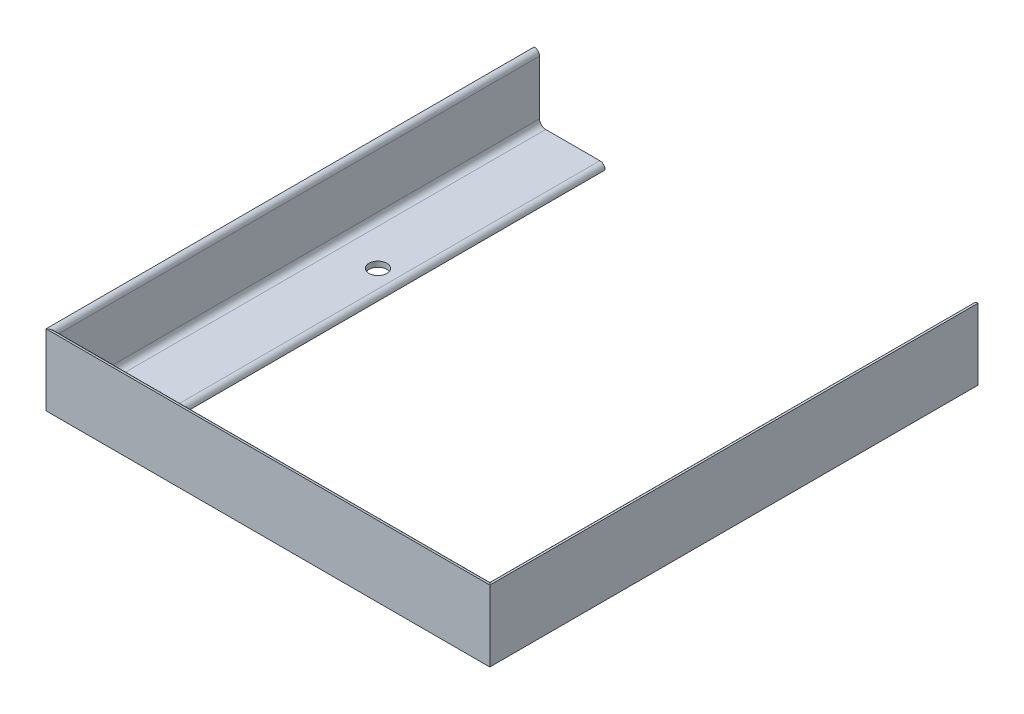
ISO-10303-21;
HEADER;
FILE_DESCRIPTION(('STEP AP214'),'2;1');
FILE_NAME('part.step','',(''),(''),'','','');
FILE_SCHEMA(('AUTOMOTIVE_DESIGN { 1 0 10303 214 1 1 1 1 }'));
ENDSEC;
DATA;
#1=APPLICATION_CONTEXT('core data for automotive mechanical design processes');
#2=APPLICATION_PROTOCOL_DEFINITION('international standard','automotive_design',2000,#1);
#3=PRODUCT_CONTEXT('',#1,'mechanical');
#4=PRODUCT('Part','Part','',(#3));
#5=PRODUCT_RELATED_PRODUCT_CATEGORY('part','',(#4));
#6=PRODUCT_DEFINITION_FORMATION('','',#4);
#7=PRODUCT_DEFINITION_CONTEXT('part definition',#1,'design');
#8=PRODUCT_DEFINITION('design','',#6,#7);
#9=PRODUCT_DEFINITION_SHAPE('','',#8);
#10=(LENGTH_UNIT() NAMED_UNIT(*) SI_UNIT(.MILLI.,.METRE.));
#11=(NAMED_UNIT(*) PLANE_ANGLE_UNIT() SI_UNIT($,.RADIAN.));
#12=(NAMED_UNIT(*) SI_UNIT($,.STERADIAN.) SOLID_ANGLE_UNIT());
#13=UNCERTAINTY_MEASURE_WITH_UNIT(LENGTH_MEASURE(1.E-05),#10,'distance_accuracy_value','');
#14=(GEOMETRIC_REPRESENTATION_CONTEXT(3) GLOBAL_UNCERTAINTY_ASSIGNED_CONTEXT((#13)) GLOBAL_UNIT_ASSIGNED_CONTEXT((#10,
#11,#12)) REPRESENTATION_CONTEXT('',''));
#15=CARTESIAN_POINT('',(0.,0.,0.));
#16=DIRECTION('',(0.,0.,1.));
#17=DIRECTION('',(1.,0.,0.));
#18=AXIS2_PLACEMENT_3D('',#15,#16,#17);
#19=CARTESIAN_POINT('',(125.,0.,137.5));
#20=DIRECTION('',(-0.707106781186548,0.,0.707106781186547));
#21=DIRECTION('',(0.707106781186548,0.,0.707106781186547));
#22=AXIS2_PLACEMENT_3D('',#19,#20,#21);
#23=PLANE('',#22);
#24=DIRECTION('',(0.,-1.,0.));
#25=VECTOR('',#24,1.);
#26=CARTESIAN_POINT('',(101.,9.99999999999898,113.5));
#27=LINE('',#26,#25);
#28=CARTESIAN_POINT('',(101.,2.99999999999975,113.5));
#29=VERTEX_POINT('',#28);
#30=CARTESIAN_POINT('',(101.000000000001,-2.53269627492614E-13,113.500000000001));
#31=VERTEX_POINT('',#30);
#32=EDGE_CURVE('E14',#29,#31,#27,.T.);
#33=ORIENTED_EDGE('',*,*,#32,.F.);
#34=DIRECTION('',(-0.707106781186548,0.,-0.707106781186547));
#35=VECTOR('',#34,1.);
#36=CARTESIAN_POINT('',(106.5,2.99999999999981,119.));
#37=LINE('',#36,#35);
#38=CARTESIAN_POINT('',(88.,2.99999999999961,100.5));
#39=VERTEX_POINT('',#38);
#40=EDGE_CURVE('E160',#29,#39,#37,.T.);
#41=ORIENTED_EDGE('',*,*,#40,.T.);
#42=CARTESIAN_POINT('',(88.0000000000001,-3.88578058618805E-13,100.5));
#43=DIRECTION('',(-0.707106781186548,0.,0.707106781186547));
#44=DIRECTION('',(-0.707106781186548,0.,-0.707106781186547));
#45=AXIS2_PLACEMENT_3D('',#42,#43,#44);
#46=ELLIPSE('',#45,4.24264068711929,3.);
#47=CARTESIAN_POINT('',(85.,-4.16333634234434E-13,97.4999999999999));
#48=VERTEX_POINT('',#47);
#49=EDGE_CURVE('E152',#39,#48,#46,.T.);
#50=ORIENTED_EDGE('',*,*,#49,.T.);
#51=DIRECTION('',(0.707106781186548,0.,0.707106781186547));
#52=VECTOR('',#51,1.);
#53=CARTESIAN_POINT('',(125.,0.,137.5));
#54=LINE('',#53,#52);
#55=EDGE_CURVE('E186',#48,#31,#54,.T.);
#56=ORIENTED_EDGE('',*,*,#55,.T.);
#57=EDGE_LOOP('',(#33,#41,#50,#56));
#58=FACE_BOUND('',#57,.T.);
#59=ADVANCED_FACE('F76',(#58),#23,.T.);
#60=CARTESIAN_POINT('',(125.,40.,137.5));
#61=DIRECTION('',(-1.,0.,0.));
#62=DIRECTION('',(0.,-1.,0.));
#63=AXIS2_PLACEMENT_3D('',#60,#61,#62);
#64=PLANE('',#63);
#65=DIRECTION('',(0.,1.,0.));
#66=VECTOR('',#65,1.);
#67=CARTESIAN_POINT('',(125.,40.,137.5));
#68=LINE('',#67,#66);
#69=CARTESIAN_POINT('',(125.,0.,137.5));
#70=VERTEX_POINT('',#69);
#71=CARTESIAN_POINT('',(125.,40.,137.5));
#72=VERTEX_POINT('',#71);
#73=EDGE_CURVE('E183',#70,#72,#68,.T.);
#74=ORIENTED_EDGE('',*,*,#73,.F.);
#75=DIRECTION('',(0.,0.,-1.));
#76=VECTOR('',#75,1.);
#77=CARTESIAN_POINT('',(125.,0.,137.5));
#78=LINE('',#77,#76);
#79=CARTESIAN_POINT('',(125.,0.,-137.5));
#80=VERTEX_POINT('',#79);
#81=EDGE_CURVE('E215',#70,#80,#78,.T.);
#82=ORIENTED_EDGE('',*,*,#81,.T.);
#83=DIRECTION('',(0.,1.,0.));
#84=VECTOR('',#83,1.);
#85=CARTESIAN_POINT('',(125.,40.,-137.5));
#86=LINE('',#85,#84);
#87=CARTESIAN_POINT('',(125.,40.,-137.5));
#88=VERTEX_POINT('',#87);
#89=EDGE_CURVE('E194',#80,#88,#86,.T.);
#90=ORIENTED_EDGE('',*,*,#89,.T.);
#91=DIRECTION('',(0.,0.,-1.));
#92=VECTOR('',#91,1.);
#93=CARTESIAN_POINT('',(125.,40.,137.5));
#94=LINE('',#93,#92);
#95=EDGE_CURVE('E190',#72,#88,#94,.T.);
#96=ORIENTED_EDGE('',*,*,#95,.F.);
#97=EDGE_LOOP('',(#74,#82,#90,#96));
#98=FACE_BOUND('',#97,.T.);
#99=ADVANCED_FACE('F262',(#98),#64,.F.);
#100=CARTESIAN_POINT('',(125.,37.,137.5));
#101=DIRECTION('',(0.,0.,-1.));
#102=DIRECTION('',(-1.,0.,0.));
#103=AXIS2_PLACEMENT_3D('',#100,#101,#102);
#104=CYLINDRICAL_SURFACE('',#103,3.00000000000001);
#105=CARTESIAN_POINT('',(125.,37.,137.5));
#106=DIRECTION('',(-0.707106781186548,0.,0.707106781186547));
#107=DIRECTION('',(-0.707106781186548,0.,-0.707106781186547));
#108=AXIS2_PLACEMENT_3D('',#105,#106,#107);
#109=ELLIPSE('',#108,4.24264068711929,3.00000000000001);
#110=CARTESIAN_POINT('',(122.,37.,134.5));
#111=VERTEX_POINT('',#110);
#112=EDGE_CURVE('E179',#72,#111,#109,.T.);
#113=ORIENTED_EDGE('',*,*,#112,.F.);
#114=ORIENTED_EDGE('',*,*,#95,.T.);
#115=CARTESIAN_POINT('',(125.,37.,-137.5));
#116=DIRECTION('',(0.,0.,1.));
#117=DIRECTION('',(1.,0.,0.));
#118=AXIS2_PLACEMENT_3D('',#115,#116,#117);
#119=CIRCLE('',#118,3.00000000000001);
#120=CARTESIAN_POINT('',(122.,37.,-137.5));
#121=VERTEX_POINT('',#120);
#122=EDGE_CURVE('E193',#88,#121,#119,.T.);
#123=ORIENTED_EDGE('',*,*,#122,.T.);
#124=DIRECTION('',(0.,0.,-1.));
#125=VECTOR('',#124,1.);
#126=CARTESIAN_POINT('',(122.,37.,137.5));
#127=LINE('',#126,#125);
#128=EDGE_CURVE('E195',#111,#121,#127,.T.);
#129=ORIENTED_EDGE('',*,*,#128,.F.);
#130=EDGE_LOOP('',(#113,#114,#123,#129));
#131=FACE_BOUND('',#130,.T.);
#132=ADVANCED_FACE('F252',(#131),#104,.T.);
#133=CARTESIAN_POINT('',(122.,6.49999999999997,137.5));
#134=DIRECTION('',(1.,0.,0.));
#135=DIRECTION('',(0.,1.,0.));
#136=AXIS2_PLACEMENT_3D('',#133,#134,#135);
#137=PLANE('',#136);
#138=DIRECTION('',(0.,-1.,0.));
#139=VECTOR('',#138,1.);
#140=CARTESIAN_POINT('',(122.,6.49999999999994,134.5));
#141=LINE('',#140,#139);
#142=CARTESIAN_POINT('',(122.,6.49999999999997,134.5));
#143=VERTEX_POINT('',#142);
#144=EDGE_CURVE('E176',#111,#143,#141,.T.);
#145=ORIENTED_EDGE('',*,*,#144,.F.);
#146=ORIENTED_EDGE('',*,*,#128,.T.);
#147=DIRECTION('',(0.,-1.,0.));
#148=VECTOR('',#147,1.);
#149=CARTESIAN_POINT('',(122.,6.49999999999997,-137.5));
#150=LINE('',#149,#148);
#151=CARTESIAN_POINT('',(122.,6.49999999999997,-137.5));
#152=VERTEX_POINT('',#151);
#153=EDGE_CURVE('E198',#121,#152,#150,.T.);
#154=ORIENTED_EDGE('',*,*,#153,.T.);
#155=DIRECTION('',(0.,0.,-1.));
#156=VECTOR('',#155,1.);
#157=CARTESIAN_POINT('',(122.,6.49999999999997,137.5));
#158=LINE('',#157,#156);
#159=EDGE_CURVE('E199',#143,#152,#158,.T.);
#160=ORIENTED_EDGE('',*,*,#159,.F.);
#161=EDGE_LOOP('',(#145,#146,#154,#160));
#162=FACE_BOUND('',#161,.T.);
#163=ADVANCED_FACE('F261',(#162),#137,.F.);
#164=CARTESIAN_POINT('',(118.5,6.49999999999993,137.5));
#165=DIRECTION('',(0.,0.,-1.));
#166=DIRECTION('',(-1.,0.,0.));
#167=AXIS2_PLACEMENT_3D('',#164,#165,#166);
#168=CYLINDRICAL_SURFACE('',#167,3.49999999999999);
#169=CARTESIAN_POINT('',(118.5,6.49999999999993,131.));
#170=DIRECTION('',(-0.707106781186548,0.,0.707106781186547));
#171=DIRECTION('',(-0.707106781186548,0.,-0.707106781186547));
#172=AXIS2_PLACEMENT_3D('',#169,#170,#171);
#173=ELLIPSE('',#172,4.94974746830583,3.49999999999999);
#174=CARTESIAN_POINT('',(118.5,2.99999999999993,131.));
#175=VERTEX_POINT('',#174);
#176=EDGE_CURVE('E165',#143,#175,#173,.F.);
#177=ORIENTED_EDGE('',*,*,#176,.F.);
#178=ORIENTED_EDGE('',*,*,#159,.T.);
#179=CARTESIAN_POINT('',(118.5,6.49999999999993,-137.5));
#180=DIRECTION('',(0.,0.,-1.));
#181=DIRECTION('',(-1.,0.,0.));
#182=AXIS2_PLACEMENT_3D('',#179,#180,#181);
#183=CIRCLE('',#182,3.49999999999999);
#184=CARTESIAN_POINT('',(118.5,2.99999999999993,-137.5));
#185=VERTEX_POINT('',#184);
#186=EDGE_CURVE('E202',#152,#185,#183,.T.);
#187=ORIENTED_EDGE('',*,*,#186,.T.);
#188=DIRECTION('',(0.,0.,-1.));
#189=VECTOR('',#188,1.);
#190=CARTESIAN_POINT('',(118.5,2.99999999999993,137.5));
#191=LINE('',#190,#189);
#192=EDGE_CURVE('E203',#175,#185,#191,.T.);
#193=ORIENTED_EDGE('',*,*,#192,.F.);
#194=EDGE_LOOP('',(#177,#178,#187,#193));
#195=FACE_BOUND('',#194,.T.);
#196=ADVANCED_FACE('F272',(#195),#168,.F.);
#197=CARTESIAN_POINT('',(88.,2.99999999999961,137.5));
#198=DIRECTION('',(0.,-1.,0.));
#199=DIRECTION('',(1.,0.,0.));
#200=AXIS2_PLACEMENT_3D('',#197,#198,#199);
#201=PLANE('',#200);
#202=CARTESIAN_POINT('',(98.0000000000015,2.99999999999972,-22.4999999999998));
#203=DIRECTION('',(0.,-1.,0.));
#204=DIRECTION('',(1.,0.,0.));
#205=AXIS2_PLACEMENT_3D('',#202,#203,#204);
#206=CIRCLE('',#205,5.00000000000001);
#207=CARTESIAN_POINT('',(103.000000000002,2.99999999999977,-22.4999999999998));
#208=VERTEX_POINT('',#207);
#209=EDGE_CURVE('E217',#208,#208,#206,.T.);
#210=ORIENTED_EDGE('',*,*,#209,.T.);
#211=EDGE_LOOP('',(#210));
#212=FACE_BOUND('',#211,.T.);
#213=ORIENTED_EDGE('',*,*,#40,.F.);
#214=CARTESIAN_POINT('',(98.,2.99999999999971,117.5));
#215=DIRECTION('',(0.,-1.,0.));
#216=DIRECTION('',(1.,0.,0.));
#217=AXIS2_PLACEMENT_3D('',#214,#215,#216);
#218=CIRCLE('',#217,5.00000000000001);
#219=CARTESIAN_POINT('',(102.,2.99999999999977,114.5));
#220=VERTEX_POINT('',#219);
#221=EDGE_CURVE('E148',#29,#220,#218,.T.);
#222=ORIENTED_EDGE('',*,*,#221,.T.);
#223=EDGE_CURVE('E157',#175,#220,#37,.T.);
#224=ORIENTED_EDGE('',*,*,#223,.F.);
#225=ORIENTED_EDGE('',*,*,#192,.T.);
#226=DIRECTION('',(-1.,0.,0.));
#227=VECTOR('',#226,1.);
#228=CARTESIAN_POINT('',(88.,2.99999999999961,-137.5));
#229=LINE('',#228,#227);
#230=CARTESIAN_POINT('',(88.,2.99999999999962,-137.5));
#231=VERTEX_POINT('',#230);
#232=EDGE_CURVE('E206',#185,#231,#229,.T.);
#233=ORIENTED_EDGE('',*,*,#232,.T.);
#234=DIRECTION('',(0.,0.,-1.));
#235=VECTOR('',#234,1.);
#236=CARTESIAN_POINT('',(88.,2.99999999999961,137.5));
#237=LINE('',#236,#235);
#238=EDGE_CURVE('E207',#39,#231,#237,.T.);
#239=ORIENTED_EDGE('',*,*,#238,.F.);
#240=EDGE_LOOP('',(#213,#222,#224,#225,#233,#239));
#241=FACE_BOUND('',#240,.T.);
#242=ADVANCED_FACE('F156',(#212,#241),#201,.F.);
#243=CARTESIAN_POINT('',(88.0000000000001,-3.88578058618805E-13,137.5));
#244=DIRECTION('',(0.,0.,-1.));
#245=DIRECTION('',(-1.,0.,0.));
#246=AXIS2_PLACEMENT_3D('',#243,#244,#245);
#247=CYLINDRICAL_SURFACE('',#246,3.);
#248=ORIENTED_EDGE('',*,*,#49,.F.);
#249=ORIENTED_EDGE('',*,*,#238,.T.);
#250=CARTESIAN_POINT('',(88.0000000000001,-3.92047505570758E-13,-137.5));
#251=DIRECTION('',(0.,0.,1.));
#252=DIRECTION('',(-1.,0.,0.));
#253=AXIS2_PLACEMENT_3D('',#250,#251,#252);
#254=CIRCLE('',#253,3.);
#255=CARTESIAN_POINT('',(85.,-4.16333634234434E-13,-137.5));
#256=VERTEX_POINT('',#255);
#257=EDGE_CURVE('E210',#231,#256,#254,.T.);
#258=ORIENTED_EDGE('',*,*,#257,.T.);
#259=DIRECTION('',(0.,0.,-1.));
#260=VECTOR('',#259,1.);
#261=CARTESIAN_POINT('',(85.,-4.21537804662364E-13,137.5));
#262=LINE('',#261,#260);
#263=EDGE_CURVE('E211',#48,#256,#262,.T.);
#264=ORIENTED_EDGE('',*,*,#263,.F.);
#265=EDGE_LOOP('',(#248,#249,#258,#264));
#266=FACE_BOUND('',#265,.T.);
#267=ADVANCED_FACE('F270',(#266),#247,.T.);
#268=CARTESIAN_POINT('',(125.,0.,137.5));
#269=DIRECTION('',(0.,1.,0.));
#270=DIRECTION('',(-1.,0.,0.));
#271=AXIS2_PLACEMENT_3D('',#268,#269,#270);
#272=PLANE('',#271);
#273=CARTESIAN_POINT('',(98.0000000000015,-2.81025203108243E-13,-22.4999999999998));
#274=DIRECTION('',(0.,1.,0.));
#275=DIRECTION('',(-1.,0.,0.));
#276=AXIS2_PLACEMENT_3D('',#273,#274,#275);
#277=CIRCLE('',#276,5.00000000000001);
#278=CARTESIAN_POINT('',(93.0000000000014,-3.32928129509469E-13,-22.4999999999998));
#279=VERTEX_POINT('',#278);
#280=EDGE_CURVE('E80',#279,#279,#277,.T.);
#281=ORIENTED_EDGE('',*,*,#280,.T.);
#282=EDGE_LOOP('',(#281));
#283=FACE_BOUND('',#282,.T.);
#284=CARTESIAN_POINT('',(102.,-2.41126563160776E-13,114.5));
#285=VERTEX_POINT('',#284);
#286=EDGE_CURVE('E99',#285,#70,#54,.T.);
#287=ORIENTED_EDGE('',*,*,#286,.F.);
#288=CARTESIAN_POINT('',(98.,-2.8275992658422E-13,117.5));
#289=DIRECTION('',(0.,1.,0.));
#290=DIRECTION('',(-1.,0.,0.));
#291=AXIS2_PLACEMENT_3D('',#288,#289,#290);
#292=CIRCLE('',#291,5.00000000000001);
#293=EDGE_CURVE('E92',#285,#31,#292,.T.);
#294=ORIENTED_EDGE('',*,*,#293,.T.);
#295=ORIENTED_EDGE('',*,*,#55,.F.);
#296=ORIENTED_EDGE('',*,*,#263,.T.);
#297=DIRECTION('',(1.,0.,0.));
#298=VECTOR('',#297,1.);
#299=CARTESIAN_POINT('',(125.,0.,-137.5));
#300=LINE('',#299,#298);
#301=EDGE_CURVE('E214',#256,#80,#300,.T.);
#302=ORIENTED_EDGE('',*,*,#301,.T.);
#303=ORIENTED_EDGE('',*,*,#81,.F.);
#304=EDGE_LOOP('',(#287,#294,#295,#296,#302,#303));
#305=FACE_BOUND('',#304,.T.);
#306=ADVANCED_FACE('F266',(#283,#305),#272,.F.);
#307=CARTESIAN_POINT('',(88.0000000000001,-3.92047505570758E-13,-137.5));
#308=DIRECTION('',(0.,0.,-1.));
#309=DIRECTION('',(-1.,0.,0.));
#310=AXIS2_PLACEMENT_3D('',#307,#308,#309);
#311=PLANE('',#310);
#312=ORIENTED_EDGE('',*,*,#89,.F.);
#313=ORIENTED_EDGE('',*,*,#301,.F.);
#314=ORIENTED_EDGE('',*,*,#257,.F.);
#315=ORIENTED_EDGE('',*,*,#232,.F.);
#316=ORIENTED_EDGE('',*,*,#186,.F.);
#317=ORIENTED_EDGE('',*,*,#153,.F.);
#318=ORIENTED_EDGE('',*,*,#122,.F.);
#319=EDGE_LOOP('',(#312,#313,#314,#315,#316,#317,#318));
#320=FACE_BOUND('',#319,.T.);
#321=ADVANCED_FACE('F257',(#320),#311,.T.);
#322=DIRECTION('',(0.,-1.,0.));
#323=VECTOR('',#322,1.);
#324=CARTESIAN_POINT('',(102.,9.99999999999896,114.5));
#325=LINE('',#324,#323);
#326=EDGE_CURVE('E86',#285,#220,#325,.F.);
#327=ORIENTED_EDGE('',*,*,#326,.F.);
#328=ORIENTED_EDGE('',*,*,#286,.T.);
#329=ORIENTED_EDGE('',*,*,#73,.T.);
#330=ORIENTED_EDGE('',*,*,#112,.T.);
#331=ORIENTED_EDGE('',*,*,#144,.T.);
#332=ORIENTED_EDGE('',*,*,#176,.T.);
#333=ORIENTED_EDGE('',*,*,#223,.T.);
#334=EDGE_LOOP('',(#327,#328,#329,#330,#331,#332,#333));
#335=FACE_BOUND('',#334,.T.);
#336=ADVANCED_FACE('F78',(#335),#23,.T.);
#337=CARTESIAN_POINT('',(98.0000000000001,9.99999999999897,117.5));
#338=DIRECTION('',(0.,-1.,0.));
#339=DIRECTION('',(1.,0.,0.));
#340=AXIS2_PLACEMENT_3D('',#337,#338,#339);
#341=CYLINDRICAL_SURFACE('',#340,5.00000000000001);
#342=ORIENTED_EDGE('',*,*,#32,.T.);
#343=ORIENTED_EDGE('',*,*,#293,.F.);
#344=ORIENTED_EDGE('',*,*,#326,.T.);
#345=ORIENTED_EDGE('',*,*,#221,.F.);
#346=EDGE_LOOP('',(#342,#343,#344,#345));
#347=FACE_BOUND('',#346,.T.);
#348=ADVANCED_FACE('F147',(#347),#341,.F.);
#349=CARTESIAN_POINT('',(98.0000000000016,9.99999999999897,-22.4999999999998));
#350=DIRECTION('',(0.,-1.,0.));
#351=DIRECTION('',(1.,0.,0.));
#352=AXIS2_PLACEMENT_3D('',#349,#350,#351);
#353=CYLINDRICAL_SURFACE('',#352,5.00000000000001);
#354=ORIENTED_EDGE('',*,*,#280,.F.);
#355=EDGE_LOOP('',(#354));
#356=FACE_BOUND('',#355,.T.);
#357=ORIENTED_EDGE('',*,*,#209,.F.);
#358=EDGE_LOOP('',(#357));
#359=FACE_BOUND('',#358,.T.);
#360=ADVANCED_FACE('F291',(#356,#359),#353,.F.);
#361=CLOSED_SHELL('',(#59,#99,#132,#163,#196,#242,#267,#306,#321,#336,#348,#360));
#362=MANIFOLD_SOLID_BREP('B2',#361);
#363=CARTESIAN_POINT('',(-125.,0.,137.5));
#364=DIRECTION('',(-0.707106781186548,0.,-0.707106781186547));
#365=DIRECTION('',(-0.707106781186547,0.,0.707106781186548));
#366=AXIS2_PLACEMENT_3D('',#363,#364,#365);
#367=PLANE('',#366);
#368=DIRECTION('',(0.,-1.,0.));
#369=VECTOR('',#368,1.);
#370=CARTESIAN_POINT('',(-101.000000000001,10.000000000001,113.500000000001));
#371=LINE('',#370,#369);
#372=CARTESIAN_POINT('',(-101.000000000001,2.99999999999975,113.500000000001));
#373=VERTEX_POINT('',#372);
#374=CARTESIAN_POINT('',(-101.,-2.51799316659314E-13,113.5));
#375=VERTEX_POINT('',#374);
#376=EDGE_CURVE('E74',#373,#375,#371,.T.);
#377=ORIENTED_EDGE('',*,*,#376,.F.);
#378=DIRECTION('',(0.707106781186547,0.,-0.707106781186548));
#379=VECTOR('',#378,1.);
#380=CARTESIAN_POINT('',(-106.5,2.99999999999981,119.));
#381=LINE('',#380,#379);
#382=CARTESIAN_POINT('',(-88.0000000000002,2.99999999999961,100.5));
#383=VERTEX_POINT('',#382);
#384=EDGE_CURVE('E565',#373,#383,#381,.T.);
#385=ORIENTED_EDGE('',*,*,#384,.T.);
#386=CARTESIAN_POINT('',(-88.0000000000002,-3.91523843261786E-13,100.5));
#387=DIRECTION('',(-0.707106781186548,0.,-0.707106781186547));
#388=DIRECTION('',(0.707106781186547,0.,-0.707106781186548));
#389=AXIS2_PLACEMENT_3D('',#386,#387,#388);
#390=ELLIPSE('',#389,4.24264068711929,3.);
#391=CARTESIAN_POINT('',(-85.,-4.18977760661176E-13,97.5000000000002));
#392=VERTEX_POINT('',#391);
#393=EDGE_CURVE('E571',#383,#392,#390,.T.);
#394=ORIENTED_EDGE('',*,*,#393,.T.);
#395=DIRECTION('',(-0.707106781186547,0.,0.707106781186548));
#396=VECTOR('',#395,1.);
#397=CARTESIAN_POINT('',(-125.,0.,137.5));
#398=LINE('',#397,#396);
#399=EDGE_CURVE('E601',#392,#375,#398,.T.);
#400=ORIENTED_EDGE('',*,*,#399,.T.);
#401=EDGE_LOOP('',(#377,#385,#394,#400));
#402=FACE_BOUND('',#401,.T.);
#403=ADVANCED_FACE('F423',(#402),#367,.T.);
#404=CARTESIAN_POINT('',(125.,0.,137.5));
#405=DIRECTION('',(0.707106781186548,0.,-0.707106781186547));
#406=DIRECTION('',(-0.707106781186547,0.,-0.707106781186548));
#407=AXIS2_PLACEMENT_3D('',#404,#405,#406);
#408=PLANE('',#407);
#409=DIRECTION('',(0.,-1.,0.));
#410=VECTOR('',#409,1.);
#411=CARTESIAN_POINT('',(102.,9.99999999999896,114.5));
#412=LINE('',#411,#410);
#413=CARTESIAN_POINT('',(102.,2.99999999999976,114.5));
#414=VERTEX_POINT('',#413);
#415=CARTESIAN_POINT('',(102.,-2.41324872642785E-13,114.5));
#416=VERTEX_POINT('',#415);
#417=EDGE_CURVE('E510',#414,#416,#412,.T.);
#418=ORIENTED_EDGE('',*,*,#417,.F.);
#419=DIRECTION('',(0.707106781186547,0.,0.707106781186548));
#420=VECTOR('',#419,1.);
#421=CARTESIAN_POINT('',(-18.4999999999999,2.99999999999847,-5.99999999999983));
#422=LINE('',#421,#420);
#423=CARTESIAN_POINT('',(118.5,2.99999999999993,131.));
#424=VERTEX_POINT('',#423);
#425=EDGE_CURVE('E521',#414,#424,#422,.T.);
#426=ORIENTED_EDGE('',*,*,#425,.T.);
#427=CARTESIAN_POINT('',(118.5,6.49999999999993,131.));
#428=DIRECTION('',(0.707106781186548,0.,-0.707106781186547));
#429=DIRECTION('',(0.707106781186547,0.,0.707106781186548));
#430=AXIS2_PLACEMENT_3D('',#427,#428,#429);
#431=ELLIPSE('',#430,4.94974746830582,3.49999999999999);
#432=CARTESIAN_POINT('',(122.,6.49999999999997,134.5));
#433=VERTEX_POINT('',#432);
#434=EDGE_CURVE('E526',#424,#433,#431,.F.);
#435=ORIENTED_EDGE('',*,*,#434,.T.);
#436=DIRECTION('',(0.,1.,0.));
#437=VECTOR('',#436,1.);
#438=CARTESIAN_POINT('',(122.,6.50000000000256,134.5));
#439=LINE('',#438,#437);
#440=CARTESIAN_POINT('',(122.,37.,134.5));
#441=VERTEX_POINT('',#440);
#442=EDGE_CURVE('E511',#433,#441,#439,.T.);
#443=ORIENTED_EDGE('',*,*,#442,.T.);
#444=CARTESIAN_POINT('',(125.,37.,137.5));
#445=DIRECTION('',(0.707106781186548,0.,-0.707106781186547));
#446=DIRECTION('',(0.707106781186547,0.,0.707106781186548));
#447=AXIS2_PLACEMENT_3D('',#444,#445,#446);
#448=ELLIPSE('',#447,4.24264068711929,3.00000000000001);
#449=CARTESIAN_POINT('',(125.,40.,137.5));
#450=VERTEX_POINT('',#449);
#451=EDGE_CURVE('E574',#441,#450,#448,.T.);
#452=ORIENTED_EDGE('',*,*,#451,.T.);
#453=DIRECTION('',(0.,-1.,0.));
#454=VECTOR('',#453,1.);
#455=CARTESIAN_POINT('',(125.,40.0000000000026,137.5));
#456=LINE('',#455,#454);
#457=CARTESIAN_POINT('',(125.,0.,137.5));
#458=VERTEX_POINT('',#457);
#459=EDGE_CURVE('E579',#450,#458,#456,.T.);
#460=ORIENTED_EDGE('',*,*,#459,.T.);
#461=DIRECTION('',(-0.707106781186547,0.,-0.707106781186548));
#462=VECTOR('',#461,1.);
#463=CARTESIAN_POINT('',(0.,-1.30930550206617E-12,12.5000000000002));
#464=LINE('',#463,#462);
#465=EDGE_CURVE('E533',#458,#416,#464,.T.);
#466=ORIENTED_EDGE('',*,*,#465,.T.);
#467=EDGE_LOOP('',(#418,#426,#435,#443,#452,#460,#466));
#468=FACE_BOUND('',#467,.T.);
#469=ADVANCED_FACE('F585',(#468),#408,.T.);
#470=CARTESIAN_POINT('',(-125.,40.,137.5));
#471=DIRECTION('',(0.,0.,-1.));
#472=DIRECTION('',(0.,1.,0.));
#473=AXIS2_PLACEMENT_3D('',#470,#471,#472);
#474=PLANE('',#473);
#475=ORIENTED_EDGE('',*,*,#459,.F.);
#476=DIRECTION('',(1.,0.,0.));
#477=VECTOR('',#476,1.);
#478=CARTESIAN_POINT('',(-125.,40.,137.5));
#479=LINE('',#478,#477);
#480=CARTESIAN_POINT('',(-125.,40.,137.5));
#481=VERTEX_POINT('',#480);
#482=EDGE_CURVE('E551',#481,#450,#479,.T.);
#483=ORIENTED_EDGE('',*,*,#482,.F.);
#484=DIRECTION('',(0.,1.,0.));
#485=VECTOR('',#484,1.);
#486=CARTESIAN_POINT('',(-125.,40.,137.5));
#487=LINE('',#486,#485);
#488=CARTESIAN_POINT('',(-125.,0.,137.5));
#489=VERTEX_POINT('',#488);
#490=EDGE_CURVE('E596',#489,#481,#487,.T.);
#491=ORIENTED_EDGE('',*,*,#490,.F.);
#492=DIRECTION('',(1.,0.,0.));
#493=VECTOR('',#492,1.);
#494=CARTESIAN_POINT('',(-125.,0.,137.5));
#495=LINE('',#494,#493);
#496=EDGE_CURVE('E554',#489,#458,#495,.T.);
#497=ORIENTED_EDGE('',*,*,#496,.T.);
#498=EDGE_LOOP('',(#475,#483,#491,#497));
#499=FACE_BOUND('',#498,.T.);
#500=ADVANCED_FACE('F611',(#499),#474,.F.);
#501=CARTESIAN_POINT('',(-125.,37.,137.5));
#502=DIRECTION('',(1.,0.,0.));
#503=DIRECTION('',(0.,0.,-1.));
#504=AXIS2_PLACEMENT_3D('',#501,#502,#503);
#505=CYLINDRICAL_SURFACE('',#504,3.00000000000001);
#506=ORIENTED_EDGE('',*,*,#451,.F.);
#507=DIRECTION('',(1.,0.,0.));
#508=VECTOR('',#507,1.);
#509=CARTESIAN_POINT('',(-125.,37.,134.5));
#510=LINE('',#509,#508);
#511=CARTESIAN_POINT('',(-122.,37.,134.5));
#512=VERTEX_POINT('',#511);
#513=EDGE_CURVE('E548',#512,#441,#510,.T.);
#514=ORIENTED_EDGE('',*,*,#513,.F.);
#515=CARTESIAN_POINT('',(-125.,37.,137.5));
#516=DIRECTION('',(-0.707106781186548,0.,-0.707106781186547));
#517=DIRECTION('',(0.707106781186547,0.,-0.707106781186548));
#518=AXIS2_PLACEMENT_3D('',#515,#516,#517);
#519=ELLIPSE('',#518,4.24264068711929,3.00000000000001);
#520=EDGE_CURVE('E594',#481,#512,#519,.T.);
#521=ORIENTED_EDGE('',*,*,#520,.F.);
#522=ORIENTED_EDGE('',*,*,#482,.T.);
#523=EDGE_LOOP('',(#506,#514,#521,#522));
#524=FACE_BOUND('',#523,.T.);
#525=ADVANCED_FACE('F614',(#524),#505,.T.);
#526=CARTESIAN_POINT('',(-125.,6.49999999999997,134.5));
#527=DIRECTION('',(0.,0.,1.));
#528=DIRECTION('',(0.,-1.,0.));
#529=AXIS2_PLACEMENT_3D('',#526,#527,#528);
#530=PLANE('',#529);
#531=ORIENTED_EDGE('',*,*,#442,.F.);
#532=DIRECTION('',(1.,0.,0.));
#533=VECTOR('',#532,1.);
#534=CARTESIAN_POINT('',(-125.,6.49999999999997,134.5));
#535=LINE('',#534,#533);
#536=CARTESIAN_POINT('',(-122.,6.49999999999997,134.5));
#537=VERTEX_POINT('',#536);
#538=EDGE_CURVE('E545',#537,#433,#535,.T.);
#539=ORIENTED_EDGE('',*,*,#538,.F.);
#540=DIRECTION('',(0.,-1.,0.));
#541=VECTOR('',#540,1.);
#542=CARTESIAN_POINT('',(-122.,6.49999999999994,134.5));
#543=LINE('',#542,#541);
#544=EDGE_CURVE('E593',#512,#537,#543,.T.);
#545=ORIENTED_EDGE('',*,*,#544,.F.);
#546=ORIENTED_EDGE('',*,*,#513,.T.);
#547=EDGE_LOOP('',(#531,#539,#545,#546));
#548=FACE_BOUND('',#547,.T.);
#549=ADVANCED_FACE('F589',(#548),#530,.F.);
#550=CARTESIAN_POINT('',(-125.,6.49999999999993,131.));
#551=DIRECTION('',(1.,0.,0.));
#552=DIRECTION('',(0.,0.,-1.));
#553=AXIS2_PLACEMENT_3D('',#550,#551,#552);
#554=CYLINDRICAL_SURFACE('',#553,3.49999999999999);
#555=ORIENTED_EDGE('',*,*,#434,.F.);
#556=DIRECTION('',(1.,0.,0.));
#557=VECTOR('',#556,1.);
#558=CARTESIAN_POINT('',(-125.,2.99999999999993,131.));
#559=LINE('',#558,#557);
#560=CARTESIAN_POINT('',(-118.5,2.99999999999993,131.));
#561=VERTEX_POINT('',#560);
#562=EDGE_CURVE('E543',#561,#424,#559,.T.);
#563=ORIENTED_EDGE('',*,*,#562,.F.);
#564=CARTESIAN_POINT('',(-118.5,6.49999999999993,131.));
#565=DIRECTION('',(-0.707106781186548,0.,-0.707106781186547));
#566=DIRECTION('',(0.707106781186547,0.,-0.707106781186548));
#567=AXIS2_PLACEMENT_3D('',#564,#565,#566);
#568=ELLIPSE('',#567,4.94974746830582,3.49999999999999);
#569=EDGE_CURVE('E570',#537,#561,#568,.F.);
#570=ORIENTED_EDGE('',*,*,#569,.F.);
#571=ORIENTED_EDGE('',*,*,#538,.T.);
#572=EDGE_LOOP('',(#555,#563,#570,#571));
#573=FACE_BOUND('',#572,.T.);
#574=ADVANCED_FACE('F592',(#573),#554,.F.);
#575=CARTESIAN_POINT('',(-125.,2.99999999999961,100.5));
#576=DIRECTION('',(0.,-1.,0.));
#577=DIRECTION('',(0.,0.,-1.));
#578=AXIS2_PLACEMENT_3D('',#575,#576,#577);
#579=PLANE('',#578);
#580=ORIENTED_EDGE('',*,*,#384,.F.);
#581=CARTESIAN_POINT('',(-98.,2.99999999999979,117.5));
#582=DIRECTION('',(0.,-1.,0.));
#583=DIRECTION('',(0.,0.,-1.));
#584=AXIS2_PLACEMENT_3D('',#581,#582,#583);
#585=CIRCLE('',#584,5.00000000000001);
#586=CARTESIAN_POINT('',(-101.999999999999,2.99999999999977,114.499999999999));
#587=VERTEX_POINT('',#586);
#588=EDGE_CURVE('E555',#373,#587,#585,.T.);
#589=ORIENTED_EDGE('',*,*,#588,.T.);
#590=EDGE_CURVE('E563',#561,#587,#381,.T.);
#591=ORIENTED_EDGE('',*,*,#590,.F.);
#592=ORIENTED_EDGE('',*,*,#562,.T.);
#593=ORIENTED_EDGE('',*,*,#425,.F.);
#594=CARTESIAN_POINT('',(98.,2.99999999999979,117.5));
#595=DIRECTION('',(0.,-1.,0.));
#596=DIRECTION('',(0.,0.,-1.));
#597=AXIS2_PLACEMENT_3D('',#594,#595,#596);
#598=CIRCLE('',#597,5.00000000000001);
#599=CARTESIAN_POINT('',(101.,2.99999999999977,113.5));
#600=VERTEX_POINT('',#599);
#601=EDGE_CURVE('E505',#414,#600,#598,.T.);
#602=ORIENTED_EDGE('',*,*,#601,.T.);
#603=CARTESIAN_POINT('',(88.,2.99999999999961,100.5));
#604=VERTEX_POINT('',#603);
#605=EDGE_CURVE('E518',#604,#600,#422,.T.);
#606=ORIENTED_EDGE('',*,*,#605,.F.);
#607=DIRECTION('',(1.,0.,0.));
#608=VECTOR('',#607,1.);
#609=CARTESIAN_POINT('',(-125.,2.99999999999961,100.5));
#610=LINE('',#609,#608);
#611=EDGE_CURVE('E541',#383,#604,#610,.T.);
#612=ORIENTED_EDGE('',*,*,#611,.F.);
#613=EDGE_LOOP('',(#580,#589,#591,#592,#593,#602,#606,#612));
#614=FACE_BOUND('',#613,.T.);
#615=ADVANCED_FACE('F516',(#614),#579,.F.);
#616=CARTESIAN_POINT('',(-125.,-3.91523843261786E-13,100.5));
#617=DIRECTION('',(1.,0.,0.));
#618=DIRECTION('',(0.,0.,-1.));
#619=AXIS2_PLACEMENT_3D('',#616,#617,#618);
#620=CYLINDRICAL_SURFACE('',#619,3.);
#621=CARTESIAN_POINT('',(88.0000000000001,-3.91523843261786E-13,100.5));
#622=DIRECTION('',(0.707106781186548,0.,-0.707106781186547));
#623=DIRECTION('',(0.707106781186547,0.,0.707106781186548));
#624=AXIS2_PLACEMENT_3D('',#621,#622,#623);
#625=ELLIPSE('',#624,4.24264068711929,3.);
#626=CARTESIAN_POINT('',(85.0000000000001,-4.18977760661176E-13,97.5000000000002));
#627=VERTEX_POINT('',#626);
#628=EDGE_CURVE('E525',#627,#604,#625,.T.);
#629=ORIENTED_EDGE('',*,*,#628,.F.);
#630=DIRECTION('',(1.,0.,0.));
#631=VECTOR('',#630,1.);
#632=CARTESIAN_POINT('',(-125.,-4.18977760661176E-13,97.5000000000002));
#633=LINE('',#632,#631);
#634=EDGE_CURVE('E537',#392,#627,#633,.T.);
#635=ORIENTED_EDGE('',*,*,#634,.F.);
#636=ORIENTED_EDGE('',*,*,#393,.F.);
#637=ORIENTED_EDGE('',*,*,#611,.T.);
#638=EDGE_LOOP('',(#629,#635,#636,#637));
#639=FACE_BOUND('',#638,.T.);
#640=ADVANCED_FACE('F619',(#639),#620,.T.);
#641=CARTESIAN_POINT('',(-125.,0.,137.5));
#642=DIRECTION('',(0.,1.,0.));
#643=DIRECTION('',(0.,0.,1.));
#644=AXIS2_PLACEMENT_3D('',#641,#642,#643);
#645=PLANE('',#644);
#646=CARTESIAN_POINT('',(-101.999999999999,-2.40912212380185E-13,114.499999999999));
#647=VERTEX_POINT('',#646);
#648=EDGE_CURVE('E540',#647,#489,#398,.T.);
#649=ORIENTED_EDGE('',*,*,#648,.F.);
#650=CARTESIAN_POINT('',(-98.,-2.09901540593194E-13,117.5));
#651=DIRECTION('',(0.,1.,0.));
#652=DIRECTION('',(0.,0.,1.));
#653=AXIS2_PLACEMENT_3D('',#650,#651,#652);
#654=CIRCLE('',#653,5.00000000000001);
#655=EDGE_CURVE('E437',#647,#375,#654,.T.);
#656=ORIENTED_EDGE('',*,*,#655,.T.);
#657=ORIENTED_EDGE('',*,*,#399,.F.);
#658=ORIENTED_EDGE('',*,*,#634,.T.);
#659=CARTESIAN_POINT('',(101.,-2.51386656396708E-13,113.5));
#660=VERTEX_POINT('',#659);
#661=EDGE_CURVE('E536',#660,#627,#464,.T.);
#662=ORIENTED_EDGE('',*,*,#661,.F.);
#663=CARTESIAN_POINT('',(98.,-2.09901540593194E-13,117.5));
#664=DIRECTION('',(0.,1.,0.));
#665=DIRECTION('',(0.,0.,1.));
#666=AXIS2_PLACEMENT_3D('',#663,#664,#665);
#667=CIRCLE('',#666,5.00000000000001);
#668=EDGE_CURVE('E445',#660,#416,#667,.T.);
#669=ORIENTED_EDGE('',*,*,#668,.T.);
#670=ORIENTED_EDGE('',*,*,#465,.F.);
#671=ORIENTED_EDGE('',*,*,#496,.F.);
#672=EDGE_LOOP('',(#649,#656,#657,#658,#662,#669,#670,#671));
#673=FACE_BOUND('',#672,.T.);
#674=ADVANCED_FACE('F607',(#673),#645,.F.);
#675=DIRECTION('',(0.,-1.,0.));
#676=VECTOR('',#675,1.);
#677=CARTESIAN_POINT('',(-101.999999999999,10.000000000001,114.499999999999));
#678=LINE('',#677,#676);
#679=EDGE_CURVE('E431',#647,#587,#678,.F.);
#680=ORIENTED_EDGE('',*,*,#679,.F.);
#681=ORIENTED_EDGE('',*,*,#648,.T.);
#682=ORIENTED_EDGE('',*,*,#490,.T.);
#683=ORIENTED_EDGE('',*,*,#520,.T.);
#684=ORIENTED_EDGE('',*,*,#544,.T.);
#685=ORIENTED_EDGE('',*,*,#569,.T.);
#686=ORIENTED_EDGE('',*,*,#590,.T.);
#687=EDGE_LOOP('',(#680,#681,#682,#683,#684,#685,#686));
#688=FACE_BOUND('',#687,.T.);
#689=ADVANCED_FACE('F568',(#688),#367,.T.);
#690=DIRECTION('',(0.,-1.,0.));
#691=VECTOR('',#690,1.);
#692=CARTESIAN_POINT('',(101.,9.99999999999897,113.5));
#693=LINE('',#692,#691);
#694=EDGE_CURVE('E502',#660,#600,#693,.F.);
#695=ORIENTED_EDGE('',*,*,#694,.F.);
#696=ORIENTED_EDGE('',*,*,#661,.T.);
#697=ORIENTED_EDGE('',*,*,#628,.T.);
#698=ORIENTED_EDGE('',*,*,#605,.T.);
#699=EDGE_LOOP('',(#695,#696,#697,#698));
#700=FACE_BOUND('',#699,.T.);
#701=ADVANCED_FACE('F425',(#700),#408,.T.);
#702=CARTESIAN_POINT('',(98.0000000000001,9.99999999999897,117.5));
#703=DIRECTION('',(0.,-1.,0.));
#704=DIRECTION('',(1.,0.,0.));
#705=AXIS2_PLACEMENT_3D('',#702,#703,#704);
#706=CYLINDRICAL_SURFACE('',#705,5.00000000000001);
#707=ORIENTED_EDGE('',*,*,#417,.T.);
#708=ORIENTED_EDGE('',*,*,#668,.F.);
#709=ORIENTED_EDGE('',*,*,#694,.T.);
#710=ORIENTED_EDGE('',*,*,#601,.F.);
#711=EDGE_LOOP('',(#707,#708,#709,#710));
#712=FACE_BOUND('',#711,.T.);
#713=ADVANCED_FACE('F504',(#712),#706,.F.);
#714=CARTESIAN_POINT('',(-97.9999999999999,10.000000000001,117.5));
#715=DIRECTION('',(0.,-1.,0.));
#716=DIRECTION('',(1.,0.,0.));
#717=AXIS2_PLACEMENT_3D('',#714,#715,#716);
#718=CYLINDRICAL_SURFACE('',#717,5.00000000000001);
#719=ORIENTED_EDGE('',*,*,#376,.T.);
#720=ORIENTED_EDGE('',*,*,#655,.F.);
#721=ORIENTED_EDGE('',*,*,#679,.T.);
#722=ORIENTED_EDGE('',*,*,#588,.F.);
#723=EDGE_LOOP('',(#719,#720,#721,#722));
#724=FACE_BOUND('',#723,.T.);
#725=ADVANCED_FACE('F558',(#724),#718,.F.);
#726=CLOSED_SHELL('',(#403,#469,#500,#525,#549,#574,#615,#640,#674,#689,#701,#713,#725));
#727=MANIFOLD_SOLID_BREP('B8',#726);
#728=CARTESIAN_POINT('',(-125.,0.,137.5));
#729=DIRECTION('',(0.707106781186547,0.,0.707106781186548));
#730=DIRECTION('',(0.707106781186548,0.,-0.707106781186547));
#731=AXIS2_PLACEMENT_3D('',#728,#729,#730);
#732=PLANE('',#731);
#733=DIRECTION('',(0.,-1.,0.));
#734=VECTOR('',#733,1.);
#735=CARTESIAN_POINT('',(-101.999999999999,10.000000000001,114.499999999999));
#736=LINE('',#735,#734);
#737=CARTESIAN_POINT('',(-101.999999999999,2.99999999999976,114.499999999999));
#738=VERTEX_POINT('',#737);
#739=CARTESIAN_POINT('',(-102.,-2.39391839684799E-13,114.5));
#740=VERTEX_POINT('',#739);
#741=EDGE_CURVE('E421',#738,#740,#736,.T.);
#742=ORIENTED_EDGE('',*,*,#741,.F.);
#743=DIRECTION('',(-0.707106781186548,0.,0.707106781186548));
#744=VECTOR('',#743,1.);
#745=CARTESIAN_POINT('',(31.,2.99999999999833,-18.4999999999999));
#746=LINE('',#745,#744);
#747=CARTESIAN_POINT('',(-118.5,2.99999999999993,131.));
#748=VERTEX_POINT('',#747);
#749=EDGE_CURVE('E833',#738,#748,#746,.T.);
#750=ORIENTED_EDGE('',*,*,#749,.T.);
#751=CARTESIAN_POINT('',(-118.5,6.49999999999993,131.));
#752=DIRECTION('',(0.707106781186547,0.,0.707106781186548));
#753=DIRECTION('',(-0.707106781186548,0.,0.707106781186547));
#754=AXIS2_PLACEMENT_3D('',#751,#752,#753);
#755=ELLIPSE('',#754,4.94974746830582,3.49999999999999);
#756=CARTESIAN_POINT('',(-122.,6.49999999999997,134.5));
#757=VERTEX_POINT('',#756);
#758=EDGE_CURVE('E861',#748,#757,#755,.F.);
#759=ORIENTED_EDGE('',*,*,#758,.T.);
#760=DIRECTION('',(0.,1.,0.));
#761=VECTOR('',#760,1.);
#762=CARTESIAN_POINT('',(-122.,6.50000000000282,134.5));
#763=LINE('',#762,#761);
#764=CARTESIAN_POINT('',(-122.,37.,134.5));
#765=VERTEX_POINT('',#764);
#766=EDGE_CURVE('E854',#757,#765,#763,.T.);
#767=ORIENTED_EDGE('',*,*,#766,.T.);
#768=CARTESIAN_POINT('',(-125.,37.,137.5));
#769=DIRECTION('',(0.707106781186547,0.,0.707106781186548));
#770=DIRECTION('',(-0.707106781186548,0.,0.707106781186547));
#771=AXIS2_PLACEMENT_3D('',#768,#769,#770);
#772=ELLIPSE('',#771,4.24264068711929,3.00000000000001);
#773=CARTESIAN_POINT('',(-125.,40.,137.5));
#774=VERTEX_POINT('',#773);
#775=EDGE_CURVE('E899',#765,#774,#772,.T.);
#776=ORIENTED_EDGE('',*,*,#775,.T.);
#777=DIRECTION('',(0.,-1.,0.));
#778=VECTOR('',#777,1.);
#779=CARTESIAN_POINT('',(-125.,40.0000000000029,137.5));
#780=LINE('',#779,#778);
#781=CARTESIAN_POINT('',(-125.,0.,137.5));
#782=VERTEX_POINT('',#781);
#783=EDGE_CURVE('E911',#774,#782,#780,.T.);
#784=ORIENTED_EDGE('',*,*,#783,.T.);
#785=DIRECTION('',(0.707106781186548,0.,-0.707106781186548));
#786=VECTOR('',#785,1.);
#787=CARTESIAN_POINT('',(12.5,-1.4363510381088E-12,0.));
#788=LINE('',#787,#786);
#789=EDGE_CURVE('E867',#782,#740,#788,.T.);
#790=ORIENTED_EDGE('',*,*,#789,.T.);
#791=EDGE_LOOP('',(#742,#750,#759,#767,#776,#784,#790));
#792=FACE_BOUND('',#791,.T.);
#793=ADVANCED_FACE('F766',(#792),#732,.T.);
#794=CARTESIAN_POINT('',(-125.,40.,-137.5));
#795=DIRECTION('',(1.,0.,0.));
#796=DIRECTION('',(0.,1.,0.));
#797=AXIS2_PLACEMENT_3D('',#794,#795,#796);
#798=PLANE('',#797);
#799=ORIENTED_EDGE('',*,*,#783,.F.);
#800=DIRECTION('',(0.,0.,1.));
#801=VECTOR('',#800,1.);
#802=CARTESIAN_POINT('',(-125.,40.,-137.5));
#803=LINE('',#802,#801);
#804=CARTESIAN_POINT('',(-125.,40.,-137.5));
#805=VERTEX_POINT('',#804);
#806=EDGE_CURVE('E870',#805,#774,#803,.T.);
#807=ORIENTED_EDGE('',*,*,#806,.F.);
#808=DIRECTION('',(0.,1.,0.));
#809=VECTOR('',#808,1.);
#810=CARTESIAN_POINT('',(-125.,40.,-137.5));
#811=LINE('',#810,#809);
#812=CARTESIAN_POINT('',(-125.,0.,-137.5));
#813=VERTEX_POINT('',#812);
#814=EDGE_CURVE('E886',#813,#805,#811,.T.);
#815=ORIENTED_EDGE('',*,*,#814,.F.);
#816=DIRECTION('',(0.,0.,1.));
#817=VECTOR('',#816,1.);
#818=CARTESIAN_POINT('',(-125.,0.,-137.5));
#819=LINE('',#818,#817);
#820=EDGE_CURVE('E874',#813,#782,#819,.T.);
#821=ORIENTED_EDGE('',*,*,#820,.T.);
#822=EDGE_LOOP('',(#799,#807,#815,#821));
#823=FACE_BOUND('',#822,.T.);
#824=ADVANCED_FACE('F930',(#823),#798,.F.);
#825=CARTESIAN_POINT('',(-125.,37.,-137.5));
#826=DIRECTION('',(0.,0.,1.));
#827=DIRECTION('',(1.,0.,0.));
#828=AXIS2_PLACEMENT_3D('',#825,#826,#827);
#829=CYLINDRICAL_SURFACE('',#828,3.00000000000001);
#830=ORIENTED_EDGE('',*,*,#775,.F.);
#831=DIRECTION('',(0.,0.,1.));
#832=VECTOR('',#831,1.);
#833=CARTESIAN_POINT('',(-122.,37.,-137.5));
#834=LINE('',#833,#832);
#835=CARTESIAN_POINT('',(-122.,37.,-137.5));
#836=VERTEX_POINT('',#835);
#837=EDGE_CURVE('E873',#836,#765,#834,.T.);
#838=ORIENTED_EDGE('',*,*,#837,.F.);
#839=CARTESIAN_POINT('',(-125.,37.,-137.5));
#840=DIRECTION('',(0.,0.,-1.));
#841=DIRECTION('',(-1.,0.,0.));
#842=AXIS2_PLACEMENT_3D('',#839,#840,#841);
#843=CIRCLE('',#842,3.00000000000001);
#844=EDGE_CURVE('E908',#805,#836,#843,.T.);
#845=ORIENTED_EDGE('',*,*,#844,.F.);
#846=ORIENTED_EDGE('',*,*,#806,.T.);
#847=EDGE_LOOP('',(#830,#838,#845,#846));
#848=FACE_BOUND('',#847,.T.);
#849=ADVANCED_FACE('F929',(#848),#829,.T.);
#850=CARTESIAN_POINT('',(-122.,6.49999999999997,-137.5));
#851=DIRECTION('',(-1.,0.,0.));
#852=DIRECTION('',(0.,-1.,0.));
#853=AXIS2_PLACEMENT_3D('',#850,#851,#852);
#854=PLANE('',#853);
#855=ORIENTED_EDGE('',*,*,#766,.F.);
#856=DIRECTION('',(0.,0.,1.));
#857=VECTOR('',#856,1.);
#858=CARTESIAN_POINT('',(-122.,6.49999999999997,-137.5));
#859=LINE('',#858,#857);
#860=CARTESIAN_POINT('',(-122.,6.49999999999997,-137.5));
#861=VERTEX_POINT('',#860);
#862=EDGE_CURVE('E877',#861,#757,#859,.T.);
#863=ORIENTED_EDGE('',*,*,#862,.F.);
#864=DIRECTION('',(0.,-1.,0.));
#865=VECTOR('',#864,1.);
#866=CARTESIAN_POINT('',(-122.,6.49999999999997,-137.5));
#867=LINE('',#866,#865);
#868=EDGE_CURVE('E906',#836,#861,#867,.T.);
#869=ORIENTED_EDGE('',*,*,#868,.F.);
#870=ORIENTED_EDGE('',*,*,#837,.T.);
#871=EDGE_LOOP('',(#855,#863,#869,#870));
#872=FACE_BOUND('',#871,.T.);
#873=ADVANCED_FACE('F918',(#872),#854,.F.);
#874=CARTESIAN_POINT('',(-118.5,6.49999999999993,-137.5));
#875=DIRECTION('',(0.,0.,1.));
#876=DIRECTION('',(1.,0.,0.));
#877=AXIS2_PLACEMENT_3D('',#874,#875,#876);
#878=CYLINDRICAL_SURFACE('',#877,3.49999999999999);
#879=ORIENTED_EDGE('',*,*,#758,.F.);
#880=DIRECTION('',(0.,0.,1.));
#881=VECTOR('',#880,1.);
#882=CARTESIAN_POINT('',(-118.5,2.99999999999993,-137.5));
#883=LINE('',#882,#881);
#884=CARTESIAN_POINT('',(-118.5,2.99999999999993,-137.5));
#885=VERTEX_POINT('',#884);
#886=EDGE_CURVE('E880',#885,#748,#883,.T.);
#887=ORIENTED_EDGE('',*,*,#886,.F.);
#888=CARTESIAN_POINT('',(-118.5,6.49999999999993,-137.5));
#889=DIRECTION('',(0.,0.,1.));
#890=DIRECTION('',(1.,0.,0.));
#891=AXIS2_PLACEMENT_3D('',#888,#889,#890);
#892=CIRCLE('',#891,3.49999999999999);
#893=EDGE_CURVE('E904',#861,#885,#892,.T.);
#894=ORIENTED_EDGE('',*,*,#893,.F.);
#895=ORIENTED_EDGE('',*,*,#862,.T.);
#896=EDGE_LOOP('',(#879,#887,#894,#895));
#897=FACE_BOUND('',#896,.T.);
#898=ADVANCED_FACE('F923',(#897),#878,.F.);
#899=CARTESIAN_POINT('',(-88.,2.99999999999961,-137.5));
#900=DIRECTION('',(0.,-1.,0.));
#901=DIRECTION('',(1.,0.,0.));
#902=AXIS2_PLACEMENT_3D('',#899,#900,#901);
#903=PLANE('',#902);
#904=CARTESIAN_POINT('',(-97.9999999999985,2.99999999999971,-22.4999999999998));
#905=DIRECTION('',(0.,-1.,0.));
#906=DIRECTION('',(1.,0.,0.));
#907=AXIS2_PLACEMENT_3D('',#904,#905,#906);
#908=CIRCLE('',#907,5.00000000000001);
#909=CARTESIAN_POINT('',(-92.9999999999985,2.99999999999966,-22.4999999999998));
#910=VERTEX_POINT('',#909);
#911=EDGE_CURVE('E887',#910,#910,#908,.T.);
#912=ORIENTED_EDGE('',*,*,#911,.T.);
#913=EDGE_LOOP('',(#912));
#914=FACE_BOUND('',#913,.T.);
#915=ORIENTED_EDGE('',*,*,#749,.F.);
#916=CARTESIAN_POINT('',(-98.,2.99999999999971,117.5));
#917=DIRECTION('',(0.,-1.,0.));
#918=DIRECTION('',(1.,0.,0.));
#919=AXIS2_PLACEMENT_3D('',#916,#917,#918);
#920=CIRCLE('',#919,5.00000000000001);
#921=CARTESIAN_POINT('',(-101.000000000001,2.99999999999977,113.500000000001));
#922=VERTEX_POINT('',#921);
#923=EDGE_CURVE('E853',#738,#922,#920,.T.);
#924=ORIENTED_EDGE('',*,*,#923,.T.);
#925=CARTESIAN_POINT('',(-88.,2.99999999999961,100.5));
#926=VERTEX_POINT('',#925);
#927=EDGE_CURVE('E826',#926,#922,#746,.T.);
#928=ORIENTED_EDGE('',*,*,#927,.F.);
#929=DIRECTION('',(0.,0.,1.));
#930=VECTOR('',#929,1.);
#931=CARTESIAN_POINT('',(-88.,2.99999999999961,-137.5));
#932=LINE('',#931,#930);
#933=CARTESIAN_POINT('',(-88.,2.99999999999961,-137.5));
#934=VERTEX_POINT('',#933);
#935=EDGE_CURVE('E882',#934,#926,#932,.T.);
#936=ORIENTED_EDGE('',*,*,#935,.F.);
#937=DIRECTION('',(1.,0.,0.));
#938=VECTOR('',#937,1.);
#939=CARTESIAN_POINT('',(-88.,2.99999999999961,-137.5));
#940=LINE('',#939,#938);
#941=EDGE_CURVE('E902',#885,#934,#940,.T.);
#942=ORIENTED_EDGE('',*,*,#941,.F.);
#943=ORIENTED_EDGE('',*,*,#886,.T.);
#944=EDGE_LOOP('',(#915,#924,#928,#936,#942,#943));
#945=FACE_BOUND('',#944,.T.);
#946=ADVANCED_FACE('F856',(#914,#945),#903,.F.);
#947=CARTESIAN_POINT('',(-88.0000000000001,-3.88578058618805E-13,-137.5));
#948=DIRECTION('',(0.,0.,1.));
#949=DIRECTION('',(1.,0.,0.));
#950=AXIS2_PLACEMENT_3D('',#947,#948,#949);
#951=CYLINDRICAL_SURFACE('',#950,3.);
#952=CARTESIAN_POINT('',(-88.0000000000001,-3.93782229046735E-13,100.5));
#953=DIRECTION('',(0.707106781186547,0.,0.707106781186548));
#954=DIRECTION('',(-0.707106781186548,0.,0.707106781186547));
#955=AXIS2_PLACEMENT_3D('',#952,#953,#954);
#956=ELLIPSE('',#955,4.24264068711929,3.);
#957=CARTESIAN_POINT('',(-85.,-4.26741975090295E-13,97.5000000000001));
#958=VERTEX_POINT('',#957);
#959=EDGE_CURVE('E860',#958,#926,#956,.T.);
#960=ORIENTED_EDGE('',*,*,#959,.F.);
#961=DIRECTION('',(0.,0.,1.));
#962=VECTOR('',#961,1.);
#963=CARTESIAN_POINT('',(-85.,-4.23272528138341E-13,-137.5));
#964=LINE('',#963,#962);
#965=CARTESIAN_POINT('',(-85.,-4.23272528138341E-13,-137.5));
#966=VERTEX_POINT('',#965);
#967=EDGE_CURVE('E884',#966,#958,#964,.T.);
#968=ORIENTED_EDGE('',*,*,#967,.F.);
#969=CARTESIAN_POINT('',(-88.0000000000001,-3.88578058618805E-13,-137.5));
#970=DIRECTION('',(0.,0.,-1.));
#971=DIRECTION('',(1.,0.,0.));
#972=AXIS2_PLACEMENT_3D('',#969,#970,#971);
#973=CIRCLE('',#972,3.);
#974=EDGE_CURVE('E900',#934,#966,#973,.T.);
#975=ORIENTED_EDGE('',*,*,#974,.F.);
#976=ORIENTED_EDGE('',*,*,#935,.T.);
#977=EDGE_LOOP('',(#960,#968,#975,#976));
#978=FACE_BOUND('',#977,.T.);
#979=ADVANCED_FACE('F936',(#978),#951,.T.);
#980=CARTESIAN_POINT('',(-125.,0.,-137.5));
#981=DIRECTION('',(0.,1.,0.));
#982=DIRECTION('',(-1.,0.,0.));
#983=AXIS2_PLACEMENT_3D('',#980,#981,#982);
#984=PLANE('',#983);
#985=CARTESIAN_POINT('',(-97.9999999999986,-2.8796409701215E-13,-22.4999999999998));
#986=DIRECTION('',(0.,1.,0.));
#987=DIRECTION('',(-1.,0.,0.));
#988=AXIS2_PLACEMENT_3D('',#985,#986,#987);
#989=CIRCLE('',#988,5.00000000000001);
#990=CARTESIAN_POINT('',(-102.999999999999,-2.35228503342455E-13,-22.4999999999998));
#991=VERTEX_POINT('',#990);
#992=EDGE_CURVE('E770',#991,#991,#989,.T.);
#993=ORIENTED_EDGE('',*,*,#992,.T.);
#994=EDGE_LOOP('',(#993));
#995=FACE_BOUND('',#994,.T.);
#996=CARTESIAN_POINT('',(-101.000000000001,-2.53269627492614E-13,113.500000000001));
#997=VERTEX_POINT('',#996);
#998=EDGE_CURVE('E818',#997,#958,#788,.T.);
#999=ORIENTED_EDGE('',*,*,#998,.F.);
#1000=CARTESIAN_POINT('',(-98.,-2.86229373536173E-13,117.5));
#1001=DIRECTION('',(0.,1.,0.));
#1002=DIRECTION('',(-1.,0.,0.));
#1003=AXIS2_PLACEMENT_3D('',#1000,#1001,#1002);
#1004=CIRCLE('',#1003,5.00000000000001);
#1005=EDGE_CURVE('E781',#997,#740,#1004,.T.);
#1006=ORIENTED_EDGE('',*,*,#1005,.T.);
#1007=ORIENTED_EDGE('',*,*,#789,.F.);
#1008=ORIENTED_EDGE('',*,*,#820,.F.);
#1009=DIRECTION('',(-1.,0.,0.));
#1010=VECTOR('',#1009,1.);
#1011=CARTESIAN_POINT('',(-125.,0.,-137.5));
#1012=LINE('',#1011,#1010);
#1013=EDGE_CURVE('E790',#966,#813,#1012,.T.);
#1014=ORIENTED_EDGE('',*,*,#1013,.F.);
#1015=ORIENTED_EDGE('',*,*,#967,.T.);
#1016=EDGE_LOOP('',(#999,#1006,#1007,#1008,#1014,#1015));
#1017=FACE_BOUND('',#1016,.T.);
#1018=ADVANCED_FACE('F932',(#995,#1017),#984,.F.);
#1019=CARTESIAN_POINT('',(-88.0000000000001,-3.88578058618805E-13,-137.5));
#1020=DIRECTION('',(0.,0.,1.));
#1021=DIRECTION('',(1.,0.,0.));
#1022=AXIS2_PLACEMENT_3D('',#1019,#1020,#1021);
#1023=PLANE('',#1022);
#1024=ORIENTED_EDGE('',*,*,#814,.T.);
#1025=ORIENTED_EDGE('',*,*,#844,.T.);
#1026=ORIENTED_EDGE('',*,*,#868,.T.);
#1027=ORIENTED_EDGE('',*,*,#893,.T.);
#1028=ORIENTED_EDGE('',*,*,#941,.T.);
#1029=ORIENTED_EDGE('',*,*,#974,.T.);
#1030=ORIENTED_EDGE('',*,*,#1013,.T.);
#1031=EDGE_LOOP('',(#1024,#1025,#1026,#1027,#1028,#1029,#1030));
#1032=FACE_BOUND('',#1031,.T.);
#1033=ADVANCED_FACE('F926',(#1032),#1023,.F.);
#1034=DIRECTION('',(0.,-1.,0.));
#1035=VECTOR('',#1034,1.);
#1036=CARTESIAN_POINT('',(-101.000000000001,10.000000000001,113.500000000001));
#1037=LINE('',#1036,#1035);
#1038=EDGE_CURVE('E775',#997,#922,#1037,.F.);
#1039=ORIENTED_EDGE('',*,*,#1038,.F.);
#1040=ORIENTED_EDGE('',*,*,#998,.T.);
#1041=ORIENTED_EDGE('',*,*,#959,.T.);
#1042=ORIENTED_EDGE('',*,*,#927,.T.);
#1043=EDGE_LOOP('',(#1039,#1040,#1041,#1042));
#1044=FACE_BOUND('',#1043,.T.);
#1045=ADVANCED_FACE('F768',(#1044),#732,.T.);
#1046=CARTESIAN_POINT('',(-97.9999999999999,10.000000000001,117.5));
#1047=DIRECTION('',(0.,-1.,0.));
#1048=DIRECTION('',(1.,0.,0.));
#1049=AXIS2_PLACEMENT_3D('',#1046,#1047,#1048);
#1050=CYLINDRICAL_SURFACE('',#1049,5.00000000000001);
#1051=ORIENTED_EDGE('',*,*,#741,.T.);
#1052=ORIENTED_EDGE('',*,*,#1005,.F.);
#1053=ORIENTED_EDGE('',*,*,#1038,.T.);
#1054=ORIENTED_EDGE('',*,*,#923,.F.);
#1055=EDGE_LOOP('',(#1051,#1052,#1053,#1054));
#1056=FACE_BOUND('',#1055,.T.);
#1057=ADVANCED_FACE('F852',(#1056),#1050,.F.);
#1058=CARTESIAN_POINT('',(-97.9999999999985,10.000000000001,-22.4999999999998));
#1059=DIRECTION('',(0.,-1.,0.));
#1060=DIRECTION('',(1.,0.,0.));
#1061=AXIS2_PLACEMENT_3D('',#1058,#1059,#1060);
#1062=CYLINDRICAL_SURFACE('',#1061,5.00000000000001);
#1063=ORIENTED_EDGE('',*,*,#992,.F.);
#1064=EDGE_LOOP('',(#1063));
#1065=FACE_BOUND('',#1064,.T.);
#1066=ORIENTED_EDGE('',*,*,#911,.F.);
#1067=EDGE_LOOP('',(#1066));
#1068=FACE_BOUND('',#1067,.T.);
#1069=ADVANCED_FACE('F955',(#1065,#1068),#1062,.F.);
#1070=CLOSED_SHELL('',(#793,#824,#849,#873,#898,#946,#979,#1018,#1033,#1045,#1057,#1069));
#1071=MANIFOLD_SOLID_BREP('B68',#1070);
#1072=ADVANCED_BREP_SHAPE_REPRESENTATION('',(#18,#362,#727,#1071),#14);
#1073=SHAPE_DEFINITION_REPRESENTATION(#9,#1072);
ENDSEC;
END-ISO-10303-21;
